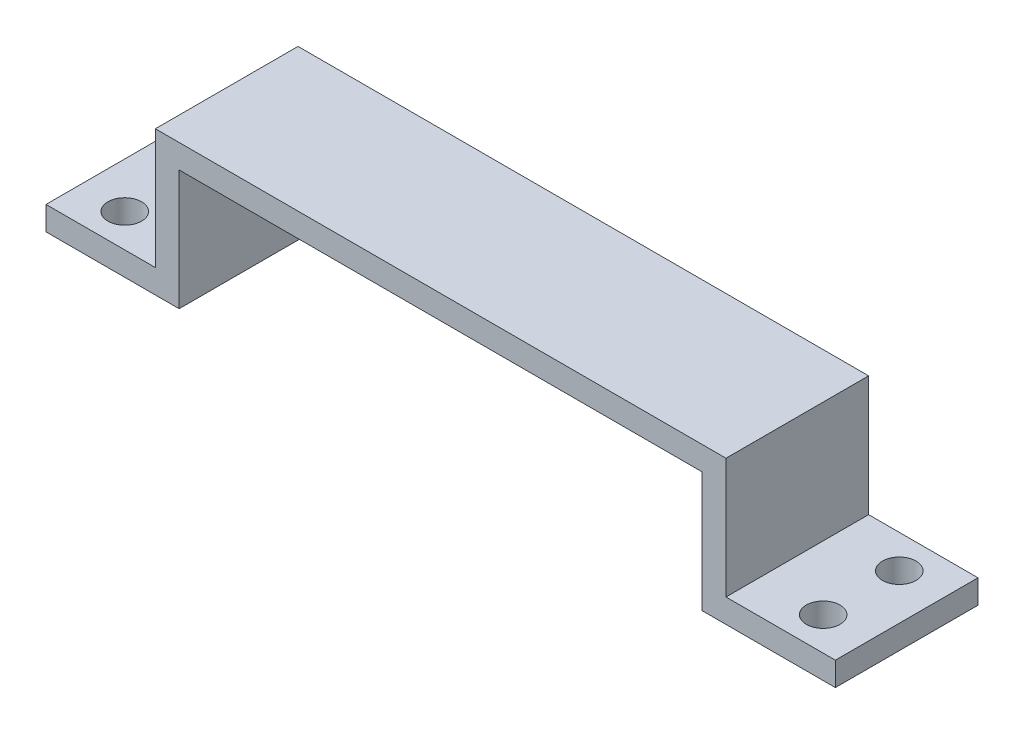
ISO-10303-21;
HEADER;
FILE_DESCRIPTION(('STEP AP214'),'2;1');
FILE_NAME('part.step','',(''),(''),'','','');
FILE_SCHEMA(('AUTOMOTIVE_DESIGN { 1 0 10303 214 1 1 1 1 }'));
ENDSEC;
DATA;
#1=APPLICATION_CONTEXT('core data for automotive mechanical design processes');
#2=APPLICATION_PROTOCOL_DEFINITION('international standard','automotive_design',2000,#1);
#3=PRODUCT_CONTEXT('',#1,'mechanical');
#4=PRODUCT('Part','Part','',(#3));
#5=PRODUCT_RELATED_PRODUCT_CATEGORY('part','',(#4));
#6=PRODUCT_DEFINITION_FORMATION('','',#4);
#7=PRODUCT_DEFINITION_CONTEXT('part definition',#1,'design');
#8=PRODUCT_DEFINITION('design','',#6,#7);
#9=PRODUCT_DEFINITION_SHAPE('','',#8);
#10=(LENGTH_UNIT() NAMED_UNIT(*) SI_UNIT(.MILLI.,.METRE.));
#11=(NAMED_UNIT(*) PLANE_ANGLE_UNIT() SI_UNIT($,.RADIAN.));
#12=(NAMED_UNIT(*) SI_UNIT($,.STERADIAN.) SOLID_ANGLE_UNIT());
#13=UNCERTAINTY_MEASURE_WITH_UNIT(LENGTH_MEASURE(1.E-05),#10,'distance_accuracy_value','');
#14=(GEOMETRIC_REPRESENTATION_CONTEXT(3) GLOBAL_UNCERTAINTY_ASSIGNED_CONTEXT((#13)) GLOBAL_UNIT_ASSIGNED_CONTEXT((#10,
#11,#12)) REPRESENTATION_CONTEXT('',''));
#15=CARTESIAN_POINT('',(0.,0.,0.));
#16=DIRECTION('',(0.,0.,1.));
#17=DIRECTION('',(1.,0.,0.));
#18=AXIS2_PLACEMENT_3D('',#15,#16,#17);
#19=CARTESIAN_POINT('',(0.,0.,19.05));
#20=DIRECTION('',(0.,-1.,0.));
#21=DIRECTION('',(1.,0.,0.));
#22=AXIS2_PLACEMENT_3D('',#19,#20,#21);
#23=PLANE('',#22);
#24=DIRECTION('',(-1.,0.,0.));
#25=VECTOR('',#24,1.);
#26=CARTESIAN_POINT('',(0.,0.,0.));
#27=LINE('',#26,#25);
#28=CARTESIAN_POINT('',(38.1,0.,0.));
#29=VERTEX_POINT('',#28);
#30=CARTESIAN_POINT('',(-38.1,0.,0.));
#31=VERTEX_POINT('',#30);
#32=EDGE_CURVE('E122',#29,#31,#27,.T.);
#33=ORIENTED_EDGE('',*,*,#32,.T.);
#34=DIRECTION('',(0.,0.,-1.));
#35=VECTOR('',#34,1.);
#36=CARTESIAN_POINT('',(-38.1,0.,19.05));
#37=LINE('',#36,#35);
#38=CARTESIAN_POINT('',(-38.1,0.,19.05));
#39=VERTEX_POINT('',#38);
#40=EDGE_CURVE('E11',#39,#31,#37,.T.);
#41=ORIENTED_EDGE('',*,*,#40,.F.);
#42=DIRECTION('',(-1.,0.,0.));
#43=VECTOR('',#42,1.);
#44=CARTESIAN_POINT('',(0.,0.,19.05));
#45=LINE('',#44,#43);
#46=CARTESIAN_POINT('',(38.1,0.,19.05));
#47=VERTEX_POINT('',#46);
#48=EDGE_CURVE('E85',#47,#39,#45,.T.);
#49=ORIENTED_EDGE('',*,*,#48,.F.);
#50=DIRECTION('',(0.,0.,-1.));
#51=VECTOR('',#50,1.);
#52=CARTESIAN_POINT('',(38.1,0.,19.05));
#53=LINE('',#52,#51);
#54=EDGE_CURVE('E193',#47,#29,#53,.T.);
#55=ORIENTED_EDGE('',*,*,#54,.T.);
#56=EDGE_LOOP('',(#33,#41,#49,#55));
#57=FACE_BOUND('',#56,.T.);
#58=ADVANCED_FACE('F31',(#57),#23,.F.);
#59=CARTESIAN_POINT('',(-38.1,0.,19.05));
#60=DIRECTION('',(1.,0.,0.));
#61=DIRECTION('',(0.,0.,-1.));
#62=AXIS2_PLACEMENT_3D('',#59,#60,#61);
#63=PLANE('',#62);
#64=DIRECTION('',(0.,-1.,0.));
#65=VECTOR('',#64,1.);
#66=CARTESIAN_POINT('',(-38.1,0.,0.));
#67=LINE('',#66,#65);
#68=CARTESIAN_POINT('',(-38.1,-16.0528,0.));
#69=VERTEX_POINT('',#68);
#70=EDGE_CURVE('E124',#31,#69,#67,.T.);
#71=ORIENTED_EDGE('',*,*,#70,.T.);
#72=DIRECTION('',(0.,0.,-1.));
#73=VECTOR('',#72,1.);
#74=CARTESIAN_POINT('',(-38.1,-16.0528,19.05));
#75=LINE('',#74,#73);
#76=CARTESIAN_POINT('',(-38.1,-16.0528,19.05));
#77=VERTEX_POINT('',#76);
#78=EDGE_CURVE('E39',#77,#69,#75,.T.);
#79=ORIENTED_EDGE('',*,*,#78,.F.);
#80=DIRECTION('',(0.,-1.,0.));
#81=VECTOR('',#80,1.);
#82=CARTESIAN_POINT('',(-38.1,0.,19.05));
#83=LINE('',#82,#81);
#84=EDGE_CURVE('E188',#39,#77,#83,.T.);
#85=ORIENTED_EDGE('',*,*,#84,.F.);
#86=ORIENTED_EDGE('',*,*,#40,.T.);
#87=EDGE_LOOP('',(#71,#79,#85,#86));
#88=FACE_BOUND('',#87,.T.);
#89=ADVANCED_FACE('F189',(#88),#63,.F.);
#90=CARTESIAN_POINT('',(-38.1,-16.0528,19.05));
#91=DIRECTION('',(0.,-1.,0.));
#92=DIRECTION('',(1.,0.,0.));
#93=AXIS2_PLACEMENT_3D('',#90,#91,#92);
#94=PLANE('',#93);
#95=CARTESIAN_POINT('',(-46.6344,-16.0528,4.445));
#96=DIRECTION('',(0.,1.,0.));
#97=DIRECTION('',(0.,0.,1.));
#98=AXIS2_PLACEMENT_3D('',#95,#96,#97);
#99=CIRCLE('',#98,2.24789999999998);
#100=CARTESIAN_POINT('',(-46.6344,-16.0528,6.69289999999998));
#101=VERTEX_POINT('',#100);
#102=EDGE_CURVE('E169',#101,#101,#99,.T.);
#103=ORIENTED_EDGE('',*,*,#102,.F.);
#104=EDGE_LOOP('',(#103));
#105=FACE_BOUND('',#104,.T.);
#106=CARTESIAN_POINT('',(-46.6344,-16.0528,14.605));
#107=DIRECTION('',(0.,1.,0.));
#108=DIRECTION('',(0.,0.,1.));
#109=AXIS2_PLACEMENT_3D('',#106,#107,#108);
#110=CIRCLE('',#109,2.24789999999998);
#111=CARTESIAN_POINT('',(-46.6344,-16.0528,16.8529));
#112=VERTEX_POINT('',#111);
#113=EDGE_CURVE('E182',#112,#112,#110,.T.);
#114=ORIENTED_EDGE('',*,*,#113,.F.);
#115=EDGE_LOOP('',(#114));
#116=FACE_BOUND('',#115,.T.);
#117=DIRECTION('',(-1.,0.,0.));
#118=VECTOR('',#117,1.);
#119=CARTESIAN_POINT('',(-38.1,-16.0528,0.));
#120=LINE('',#119,#118);
#121=CARTESIAN_POINT('',(-52.705,-16.0528,0.));
#122=VERTEX_POINT('',#121);
#123=EDGE_CURVE('E127',#69,#122,#120,.T.);
#124=ORIENTED_EDGE('',*,*,#123,.T.);
#125=DIRECTION('',(0.,0.,-1.));
#126=VECTOR('',#125,1.);
#127=CARTESIAN_POINT('',(-52.705,-16.0528,19.05));
#128=LINE('',#127,#126);
#129=CARTESIAN_POINT('',(-52.705,-16.0528,19.05));
#130=VERTEX_POINT('',#129);
#131=EDGE_CURVE('E111',#130,#122,#128,.T.);
#132=ORIENTED_EDGE('',*,*,#131,.F.);
#133=DIRECTION('',(-1.,0.,0.));
#134=VECTOR('',#133,1.);
#135=CARTESIAN_POINT('',(-38.1,-16.0528,19.05));
#136=LINE('',#135,#134);
#137=EDGE_CURVE('E102',#77,#130,#136,.T.);
#138=ORIENTED_EDGE('',*,*,#137,.F.);
#139=ORIENTED_EDGE('',*,*,#78,.T.);
#140=EDGE_LOOP('',(#124,#132,#138,#139));
#141=FACE_BOUND('',#140,.T.);
#142=ADVANCED_FACE('F141',(#105,#116,#141),#94,.F.);
#143=CARTESIAN_POINT('',(-52.705,-16.0528,19.05));
#144=DIRECTION('',(1.,0.,0.));
#145=DIRECTION('',(0.,0.,-1.));
#146=AXIS2_PLACEMENT_3D('',#143,#144,#145);
#147=PLANE('',#146);
#148=DIRECTION('',(0.,-1.,0.));
#149=VECTOR('',#148,1.);
#150=CARTESIAN_POINT('',(-52.705,-16.0528,0.));
#151=LINE('',#150,#149);
#152=CARTESIAN_POINT('',(-52.705,-19.2278,0.));
#153=VERTEX_POINT('',#152);
#154=EDGE_CURVE('E110',#122,#153,#151,.T.);
#155=ORIENTED_EDGE('',*,*,#154,.T.);
#156=DIRECTION('',(0.,0.,-1.));
#157=VECTOR('',#156,1.);
#158=CARTESIAN_POINT('',(-52.705,-19.2278,19.05));
#159=LINE('',#158,#157);
#160=CARTESIAN_POINT('',(-52.705,-19.2278,19.05));
#161=VERTEX_POINT('',#160);
#162=EDGE_CURVE('E107',#161,#153,#159,.T.);
#163=ORIENTED_EDGE('',*,*,#162,.F.);
#164=DIRECTION('',(0.,-1.,0.));
#165=VECTOR('',#164,1.);
#166=CARTESIAN_POINT('',(-52.705,-16.0528,19.05));
#167=LINE('',#166,#165);
#168=EDGE_CURVE('E96',#130,#161,#167,.T.);
#169=ORIENTED_EDGE('',*,*,#168,.F.);
#170=ORIENTED_EDGE('',*,*,#131,.T.);
#171=EDGE_LOOP('',(#155,#163,#169,#170));
#172=FACE_BOUND('',#171,.T.);
#173=ADVANCED_FACE('F108',(#172),#147,.F.);
#174=CARTESIAN_POINT('',(-52.705,-19.2278,19.05));
#175=DIRECTION('',(0.,1.,0.));
#176=DIRECTION('',(0.,0.,1.));
#177=AXIS2_PLACEMENT_3D('',#174,#175,#176);
#178=PLANE('',#177);
#179=CARTESIAN_POINT('',(-46.6344,-19.2278,4.445));
#180=DIRECTION('',(0.,1.,0.));
#181=DIRECTION('',(0.,0.,1.));
#182=AXIS2_PLACEMENT_3D('',#179,#180,#181);
#183=CIRCLE('',#182,2.2479);
#184=CARTESIAN_POINT('',(-46.6344,-19.2278,6.6929));
#185=VERTEX_POINT('',#184);
#186=EDGE_CURVE('E173',#185,#185,#183,.T.);
#187=ORIENTED_EDGE('',*,*,#186,.T.);
#188=EDGE_LOOP('',(#187));
#189=FACE_BOUND('',#188,.T.);
#190=CARTESIAN_POINT('',(-46.6344,-19.2278,14.605));
#191=DIRECTION('',(0.,1.,0.));
#192=DIRECTION('',(0.,0.,1.));
#193=AXIS2_PLACEMENT_3D('',#190,#191,#192);
#194=CIRCLE('',#193,2.2479);
#195=CARTESIAN_POINT('',(-46.6344,-19.2278,16.8529));
#196=VERTEX_POINT('',#195);
#197=EDGE_CURVE('E125',#196,#196,#194,.T.);
#198=ORIENTED_EDGE('',*,*,#197,.T.);
#199=EDGE_LOOP('',(#198));
#200=FACE_BOUND('',#199,.T.);
#201=DIRECTION('',(1.,0.,0.));
#202=VECTOR('',#201,1.);
#203=CARTESIAN_POINT('',(-52.705,-19.2278,0.));
#204=LINE('',#203,#202);
#205=CARTESIAN_POINT('',(-34.925,-19.2278,0.));
#206=VERTEX_POINT('',#205);
#207=EDGE_CURVE('E71',#153,#206,#204,.T.);
#208=ORIENTED_EDGE('',*,*,#207,.T.);
#209=DIRECTION('',(0.,0.,-1.));
#210=VECTOR('',#209,1.);
#211=CARTESIAN_POINT('',(-34.925,-19.2278,19.05));
#212=LINE('',#211,#210);
#213=CARTESIAN_POINT('',(-34.925,-19.2278,19.05));
#214=VERTEX_POINT('',#213);
#215=EDGE_CURVE('E112',#214,#206,#212,.T.);
#216=ORIENTED_EDGE('',*,*,#215,.F.);
#217=DIRECTION('',(1.,0.,0.));
#218=VECTOR('',#217,1.);
#219=CARTESIAN_POINT('',(-52.705,-19.2278,19.05));
#220=LINE('',#219,#218);
#221=EDGE_CURVE('E100',#161,#214,#220,.T.);
#222=ORIENTED_EDGE('',*,*,#221,.F.);
#223=ORIENTED_EDGE('',*,*,#162,.T.);
#224=EDGE_LOOP('',(#208,#216,#222,#223));
#225=FACE_BOUND('',#224,.T.);
#226=ADVANCED_FACE('F114',(#189,#200,#225),#178,.F.);
#227=CARTESIAN_POINT('',(-34.925,-19.2278,19.05));
#228=DIRECTION('',(-1.,0.,0.));
#229=DIRECTION('',(0.,0.,1.));
#230=AXIS2_PLACEMENT_3D('',#227,#228,#229);
#231=PLANE('',#230);
#232=DIRECTION('',(0.,1.,0.));
#233=VECTOR('',#232,1.);
#234=CARTESIAN_POINT('',(-34.925,-19.2278,0.));
#235=LINE('',#234,#233);
#236=CARTESIAN_POINT('',(-34.925,-3.175,0.));
#237=VERTEX_POINT('',#236);
#238=EDGE_CURVE('E77',#206,#237,#235,.T.);
#239=ORIENTED_EDGE('',*,*,#238,.T.);
#240=DIRECTION('',(0.,0.,-1.));
#241=VECTOR('',#240,1.);
#242=CARTESIAN_POINT('',(-34.925,-3.175,19.05));
#243=LINE('',#242,#241);
#244=CARTESIAN_POINT('',(-34.925,-3.175,19.05));
#245=VERTEX_POINT('',#244);
#246=EDGE_CURVE('E121',#245,#237,#243,.T.);
#247=ORIENTED_EDGE('',*,*,#246,.F.);
#248=DIRECTION('',(0.,1.,0.));
#249=VECTOR('',#248,1.);
#250=CARTESIAN_POINT('',(-34.925,-19.2278,19.05));
#251=LINE('',#250,#249);
#252=EDGE_CURVE('E47',#214,#245,#251,.T.);
#253=ORIENTED_EDGE('',*,*,#252,.F.);
#254=ORIENTED_EDGE('',*,*,#215,.T.);
#255=EDGE_LOOP('',(#239,#247,#253,#254));
#256=FACE_BOUND('',#255,.T.);
#257=ADVANCED_FACE('F289',(#256),#231,.F.);
#258=CARTESIAN_POINT('',(-34.925,-3.175,19.05));
#259=DIRECTION('',(0.,1.,0.));
#260=DIRECTION('',(-1.,0.,0.));
#261=AXIS2_PLACEMENT_3D('',#258,#259,#260);
#262=PLANE('',#261);
#263=DIRECTION('',(1.,0.,0.));
#264=VECTOR('',#263,1.);
#265=CARTESIAN_POINT('',(-34.925,-3.175,0.));
#266=LINE('',#265,#264);
#267=CARTESIAN_POINT('',(34.925,-3.175,0.));
#268=VERTEX_POINT('',#267);
#269=EDGE_CURVE('E132',#237,#268,#266,.T.);
#270=ORIENTED_EDGE('',*,*,#269,.T.);
#271=DIRECTION('',(0.,0.,-1.));
#272=VECTOR('',#271,1.);
#273=CARTESIAN_POINT('',(34.925,-3.175,19.05));
#274=LINE('',#273,#272);
#275=CARTESIAN_POINT('',(34.925,-3.175,19.05));
#276=VERTEX_POINT('',#275);
#277=EDGE_CURVE('E160',#276,#268,#274,.T.);
#278=ORIENTED_EDGE('',*,*,#277,.F.);
#279=DIRECTION('',(1.,0.,0.));
#280=VECTOR('',#279,1.);
#281=CARTESIAN_POINT('',(-34.925,-3.175,19.05));
#282=LINE('',#281,#280);
#283=EDGE_CURVE('E116',#245,#276,#282,.T.);
#284=ORIENTED_EDGE('',*,*,#283,.F.);
#285=ORIENTED_EDGE('',*,*,#246,.T.);
#286=EDGE_LOOP('',(#270,#278,#284,#285));
#287=FACE_BOUND('',#286,.T.);
#288=ADVANCED_FACE('F157',(#287),#262,.F.);
#289=CARTESIAN_POINT('',(0.,0.,19.05));
#290=DIRECTION('',(0.,0.,1.));
#291=DIRECTION('',(1.,0.,0.));
#292=AXIS2_PLACEMENT_3D('',#289,#290,#291);
#293=PLANE('',#292);
#294=ORIENTED_EDGE('',*,*,#283,.T.);
#295=DIRECTION('',(0.,1.,0.));
#296=VECTOR('',#295,1.);
#297=CARTESIAN_POINT('',(34.925,-19.2278,19.05));
#298=LINE('',#297,#296);
#299=CARTESIAN_POINT('',(34.925,-19.2278,19.05));
#300=VERTEX_POINT('',#299);
#301=EDGE_CURVE('E168',#300,#276,#298,.T.);
#302=ORIENTED_EDGE('',*,*,#301,.F.);
#303=DIRECTION('',(-1.,0.,0.));
#304=VECTOR('',#303,1.);
#305=CARTESIAN_POINT('',(52.705,-19.2278,19.05));
#306=LINE('',#305,#304);
#307=CARTESIAN_POINT('',(52.705,-19.2278,19.05));
#308=VERTEX_POINT('',#307);
#309=EDGE_CURVE('E229',#308,#300,#306,.T.);
#310=ORIENTED_EDGE('',*,*,#309,.F.);
#311=DIRECTION('',(0.,-1.,0.));
#312=VECTOR('',#311,1.);
#313=CARTESIAN_POINT('',(52.705,-16.0528,19.05));
#314=LINE('',#313,#312);
#315=CARTESIAN_POINT('',(52.705,-16.0528,19.05));
#316=VERTEX_POINT('',#315);
#317=EDGE_CURVE('E233',#316,#308,#314,.T.);
#318=ORIENTED_EDGE('',*,*,#317,.F.);
#319=DIRECTION('',(1.,0.,0.));
#320=VECTOR('',#319,1.);
#321=CARTESIAN_POINT('',(38.1,-16.0528,19.05));
#322=LINE('',#321,#320);
#323=CARTESIAN_POINT('',(38.1,-16.0528,19.05));
#324=VERTEX_POINT('',#323);
#325=EDGE_CURVE('E235',#324,#316,#322,.T.);
#326=ORIENTED_EDGE('',*,*,#325,.F.);
#327=DIRECTION('',(0.,-1.,0.));
#328=VECTOR('',#327,1.);
#329=CARTESIAN_POINT('',(38.1,0.,19.05));
#330=LINE('',#329,#328);
#331=EDGE_CURVE('E241',#47,#324,#330,.T.);
#332=ORIENTED_EDGE('',*,*,#331,.F.);
#333=ORIENTED_EDGE('',*,*,#48,.T.);
#334=ORIENTED_EDGE('',*,*,#84,.T.);
#335=ORIENTED_EDGE('',*,*,#137,.T.);
#336=ORIENTED_EDGE('',*,*,#168,.T.);
#337=ORIENTED_EDGE('',*,*,#221,.T.);
#338=ORIENTED_EDGE('',*,*,#252,.T.);
#339=EDGE_LOOP('',(#294,#302,#310,#318,#326,#332,#333,#334,#335,#336,#337,#338));
#340=FACE_BOUND('',#339,.T.);
#341=ADVANCED_FACE('F98',(#340),#293,.T.);
#342=CARTESIAN_POINT('',(0.,0.,0.));
#343=DIRECTION('',(0.,0.,1.));
#344=DIRECTION('',(1.,0.,0.));
#345=AXIS2_PLACEMENT_3D('',#342,#343,#344);
#346=PLANE('',#345);
#347=ORIENTED_EDGE('',*,*,#32,.F.);
#348=DIRECTION('',(0.,-1.,0.));
#349=VECTOR('',#348,1.);
#350=CARTESIAN_POINT('',(38.1,0.,0.));
#351=LINE('',#350,#349);
#352=CARTESIAN_POINT('',(38.1,-16.0528,0.));
#353=VERTEX_POINT('',#352);
#354=EDGE_CURVE('E198',#29,#353,#351,.T.);
#355=ORIENTED_EDGE('',*,*,#354,.T.);
#356=DIRECTION('',(1.,0.,0.));
#357=VECTOR('',#356,1.);
#358=CARTESIAN_POINT('',(38.1,-16.0528,0.));
#359=LINE('',#358,#357);
#360=CARTESIAN_POINT('',(52.705,-16.0528,0.));
#361=VERTEX_POINT('',#360);
#362=EDGE_CURVE('E250',#353,#361,#359,.T.);
#363=ORIENTED_EDGE('',*,*,#362,.T.);
#364=DIRECTION('',(0.,-1.,0.));
#365=VECTOR('',#364,1.);
#366=CARTESIAN_POINT('',(52.705,-16.0528,0.));
#367=LINE('',#366,#365);
#368=CARTESIAN_POINT('',(52.705,-19.2278,0.));
#369=VERTEX_POINT('',#368);
#370=EDGE_CURVE('E247',#361,#369,#367,.T.);
#371=ORIENTED_EDGE('',*,*,#370,.T.);
#372=DIRECTION('',(-1.,0.,0.));
#373=VECTOR('',#372,1.);
#374=CARTESIAN_POINT('',(52.705,-19.2278,0.));
#375=LINE('',#374,#373);
#376=CARTESIAN_POINT('',(34.925,-19.2278,0.));
#377=VERTEX_POINT('',#376);
#378=EDGE_CURVE('E244',#369,#377,#375,.T.);
#379=ORIENTED_EDGE('',*,*,#378,.T.);
#380=DIRECTION('',(0.,1.,0.));
#381=VECTOR('',#380,1.);
#382=CARTESIAN_POINT('',(34.925,-19.2278,0.));
#383=LINE('',#382,#381);
#384=EDGE_CURVE('E153',#377,#268,#383,.T.);
#385=ORIENTED_EDGE('',*,*,#384,.T.);
#386=ORIENTED_EDGE('',*,*,#269,.F.);
#387=ORIENTED_EDGE('',*,*,#238,.F.);
#388=ORIENTED_EDGE('',*,*,#207,.F.);
#389=ORIENTED_EDGE('',*,*,#154,.F.);
#390=ORIENTED_EDGE('',*,*,#123,.F.);
#391=ORIENTED_EDGE('',*,*,#70,.F.);
#392=EDGE_LOOP('',(#347,#355,#363,#371,#379,#385,#386,#387,#388,#389,#390,#391));
#393=FACE_BOUND('',#392,.T.);
#394=ADVANCED_FACE('F147',(#393),#346,.F.);
#395=CARTESIAN_POINT('',(-46.6344,-16.0528,14.605));
#396=DIRECTION('',(0.,1.,0.));
#397=DIRECTION('',(0.,0.,1.));
#398=AXIS2_PLACEMENT_3D('',#395,#396,#397);
#399=CYLINDRICAL_SURFACE('',#398,2.24789999999999);
#400=ORIENTED_EDGE('',*,*,#197,.F.);
#401=EDGE_LOOP('',(#400));
#402=FACE_BOUND('',#401,.T.);
#403=ORIENTED_EDGE('',*,*,#113,.T.);
#404=EDGE_LOOP('',(#403));
#405=FACE_BOUND('',#404,.T.);
#406=ADVANCED_FACE('F297',(#402,#405),#399,.F.);
#407=CARTESIAN_POINT('',(-46.6344,-16.0528,4.445));
#408=DIRECTION('',(0.,1.,0.));
#409=DIRECTION('',(0.,0.,1.));
#410=AXIS2_PLACEMENT_3D('',#407,#408,#409);
#411=CYLINDRICAL_SURFACE('',#410,2.24789999999999);
#412=ORIENTED_EDGE('',*,*,#186,.F.);
#413=EDGE_LOOP('',(#412));
#414=FACE_BOUND('',#413,.T.);
#415=ORIENTED_EDGE('',*,*,#102,.T.);
#416=EDGE_LOOP('',(#415));
#417=FACE_BOUND('',#416,.T.);
#418=ADVANCED_FACE('F302',(#414,#417),#411,.F.);
#419=CARTESIAN_POINT('',(34.925,-19.2278,19.05));
#420=DIRECTION('',(-1.,0.,0.));
#421=DIRECTION('',(0.,0.,1.));
#422=AXIS2_PLACEMENT_3D('',#419,#420,#421);
#423=PLANE('',#422);
#424=ORIENTED_EDGE('',*,*,#384,.F.);
#425=DIRECTION('',(0.,0.,-1.));
#426=VECTOR('',#425,1.);
#427=CARTESIAN_POINT('',(34.925,-19.2278,19.05));
#428=LINE('',#427,#426);
#429=EDGE_CURVE('E170',#300,#377,#428,.T.);
#430=ORIENTED_EDGE('',*,*,#429,.F.);
#431=ORIENTED_EDGE('',*,*,#301,.T.);
#432=ORIENTED_EDGE('',*,*,#277,.T.);
#433=EDGE_LOOP('',(#424,#430,#431,#432));
#434=FACE_BOUND('',#433,.T.);
#435=ADVANCED_FACE('F165',(#434),#423,.T.);
#436=CARTESIAN_POINT('',(52.705,-19.2278,19.05));
#437=DIRECTION('',(0.,-1.,0.));
#438=DIRECTION('',(0.,0.,-1.));
#439=AXIS2_PLACEMENT_3D('',#436,#437,#438);
#440=PLANE('',#439);
#441=CARTESIAN_POINT('',(46.6344,-19.2278,4.445));
#442=DIRECTION('',(0.,1.,0.));
#443=DIRECTION('',(0.,0.,1.));
#444=AXIS2_PLACEMENT_3D('',#441,#442,#443);
#445=CIRCLE('',#444,2.2479);
#446=CARTESIAN_POINT('',(46.6344,-19.2278,6.6929));
#447=VERTEX_POINT('',#446);
#448=EDGE_CURVE('E347',#447,#447,#445,.T.);
#449=ORIENTED_EDGE('',*,*,#448,.T.);
#450=EDGE_LOOP('',(#449));
#451=FACE_BOUND('',#450,.T.);
#452=CARTESIAN_POINT('',(46.6344,-19.2278,14.605));
#453=DIRECTION('',(0.,1.,0.));
#454=DIRECTION('',(0.,0.,1.));
#455=AXIS2_PLACEMENT_3D('',#452,#453,#454);
#456=CIRCLE('',#455,2.2479);
#457=CARTESIAN_POINT('',(46.6344,-19.2278,16.8529));
#458=VERTEX_POINT('',#457);
#459=EDGE_CURVE('E245',#458,#458,#456,.T.);
#460=ORIENTED_EDGE('',*,*,#459,.T.);
#461=EDGE_LOOP('',(#460));
#462=FACE_BOUND('',#461,.T.);
#463=ORIENTED_EDGE('',*,*,#378,.F.);
#464=DIRECTION('',(0.,0.,-1.));
#465=VECTOR('',#464,1.);
#466=CARTESIAN_POINT('',(52.705,-19.2278,19.05));
#467=LINE('',#466,#465);
#468=EDGE_CURVE('E176',#308,#369,#467,.T.);
#469=ORIENTED_EDGE('',*,*,#468,.F.);
#470=ORIENTED_EDGE('',*,*,#309,.T.);
#471=ORIENTED_EDGE('',*,*,#429,.T.);
#472=EDGE_LOOP('',(#463,#469,#470,#471));
#473=FACE_BOUND('',#472,.T.);
#474=ADVANCED_FACE('F232',(#451,#462,#473),#440,.T.);
#475=CARTESIAN_POINT('',(52.705,-16.0528,19.05));
#476=DIRECTION('',(1.,0.,0.));
#477=DIRECTION('',(0.,0.,-1.));
#478=AXIS2_PLACEMENT_3D('',#475,#476,#477);
#479=PLANE('',#478);
#480=ORIENTED_EDGE('',*,*,#370,.F.);
#481=DIRECTION('',(0.,0.,-1.));
#482=VECTOR('',#481,1.);
#483=CARTESIAN_POINT('',(52.705,-16.0528,19.05));
#484=LINE('',#483,#482);
#485=EDGE_CURVE('E255',#316,#361,#484,.T.);
#486=ORIENTED_EDGE('',*,*,#485,.F.);
#487=ORIENTED_EDGE('',*,*,#317,.T.);
#488=ORIENTED_EDGE('',*,*,#468,.T.);
#489=EDGE_LOOP('',(#480,#486,#487,#488));
#490=FACE_BOUND('',#489,.T.);
#491=ADVANCED_FACE('F258',(#490),#479,.T.);
#492=CARTESIAN_POINT('',(38.1,-16.0528,19.05));
#493=DIRECTION('',(0.,1.,0.));
#494=DIRECTION('',(-1.,0.,0.));
#495=AXIS2_PLACEMENT_3D('',#492,#493,#494);
#496=PLANE('',#495);
#497=CARTESIAN_POINT('',(46.6344,-16.0528,4.445));
#498=DIRECTION('',(0.,1.,0.));
#499=DIRECTION('',(0.,0.,1.));
#500=AXIS2_PLACEMENT_3D('',#497,#498,#499);
#501=CIRCLE('',#500,2.24789999999998);
#502=CARTESIAN_POINT('',(46.6344,-16.0528,6.69289999999998));
#503=VERTEX_POINT('',#502);
#504=EDGE_CURVE('E350',#503,#503,#501,.T.);
#505=ORIENTED_EDGE('',*,*,#504,.F.);
#506=EDGE_LOOP('',(#505));
#507=FACE_BOUND('',#506,.T.);
#508=CARTESIAN_POINT('',(46.6344,-16.0528,14.605));
#509=DIRECTION('',(0.,1.,0.));
#510=DIRECTION('',(0.,0.,1.));
#511=AXIS2_PLACEMENT_3D('',#508,#509,#510);
#512=CIRCLE('',#511,2.24789999999998);
#513=CARTESIAN_POINT('',(46.6344,-16.0528,16.8529));
#514=VERTEX_POINT('',#513);
#515=EDGE_CURVE('E352',#514,#514,#512,.T.);
#516=ORIENTED_EDGE('',*,*,#515,.F.);
#517=EDGE_LOOP('',(#516));
#518=FACE_BOUND('',#517,.T.);
#519=ORIENTED_EDGE('',*,*,#362,.F.);
#520=DIRECTION('',(0.,0.,-1.));
#521=VECTOR('',#520,1.);
#522=CARTESIAN_POINT('',(38.1,-16.0528,19.05));
#523=LINE('',#522,#521);
#524=EDGE_CURVE('E206',#324,#353,#523,.T.);
#525=ORIENTED_EDGE('',*,*,#524,.F.);
#526=ORIENTED_EDGE('',*,*,#325,.T.);
#527=ORIENTED_EDGE('',*,*,#485,.T.);
#528=EDGE_LOOP('',(#519,#525,#526,#527));
#529=FACE_BOUND('',#528,.T.);
#530=ADVANCED_FACE('F260',(#507,#518,#529),#496,.T.);
#531=CARTESIAN_POINT('',(38.1,0.,19.05));
#532=DIRECTION('',(1.,0.,0.));
#533=DIRECTION('',(0.,0.,-1.));
#534=AXIS2_PLACEMENT_3D('',#531,#532,#533);
#535=PLANE('',#534);
#536=ORIENTED_EDGE('',*,*,#354,.F.);
#537=ORIENTED_EDGE('',*,*,#54,.F.);
#538=ORIENTED_EDGE('',*,*,#331,.T.);
#539=ORIENTED_EDGE('',*,*,#524,.T.);
#540=EDGE_LOOP('',(#536,#537,#538,#539));
#541=FACE_BOUND('',#540,.T.);
#542=ADVANCED_FACE('F262',(#541),#535,.T.);
#543=CARTESIAN_POINT('',(46.6344,-16.0528,14.605));
#544=DIRECTION('',(0.,1.,0.));
#545=DIRECTION('',(0.,0.,1.));
#546=AXIS2_PLACEMENT_3D('',#543,#544,#545);
#547=CYLINDRICAL_SURFACE('',#546,2.24789999999999);
#548=ORIENTED_EDGE('',*,*,#459,.F.);
#549=EDGE_LOOP('',(#548));
#550=FACE_BOUND('',#549,.T.);
#551=ORIENTED_EDGE('',*,*,#515,.T.);
#552=EDGE_LOOP('',(#551));
#553=FACE_BOUND('',#552,.T.);
#554=ADVANCED_FACE('F264',(#550,#553),#547,.F.);
#555=CARTESIAN_POINT('',(46.6344,-16.0528,4.445));
#556=DIRECTION('',(0.,1.,0.));
#557=DIRECTION('',(0.,0.,1.));
#558=AXIS2_PLACEMENT_3D('',#555,#556,#557);
#559=CYLINDRICAL_SURFACE('',#558,2.24789999999999);
#560=ORIENTED_EDGE('',*,*,#448,.F.);
#561=EDGE_LOOP('',(#560));
#562=FACE_BOUND('',#561,.T.);
#563=ORIENTED_EDGE('',*,*,#504,.T.);
#564=EDGE_LOOP('',(#563));
#565=FACE_BOUND('',#564,.T.);
#566=ADVANCED_FACE('F270',(#562,#565),#559,.F.);
#567=CLOSED_SHELL('',(#58,#89,#142,#173,#226,#257,#288,#341,#394,#406,#418,#435,#474,#491,#530,
#542,#554,#566));
#568=MANIFOLD_SOLID_BREP('B2',#567);
#569=ADVANCED_BREP_SHAPE_REPRESENTATION('',(#18,#568),#14);
#570=SHAPE_DEFINITION_REPRESENTATION(#9,#569);
ENDSEC;
END-ISO-10303-21;
